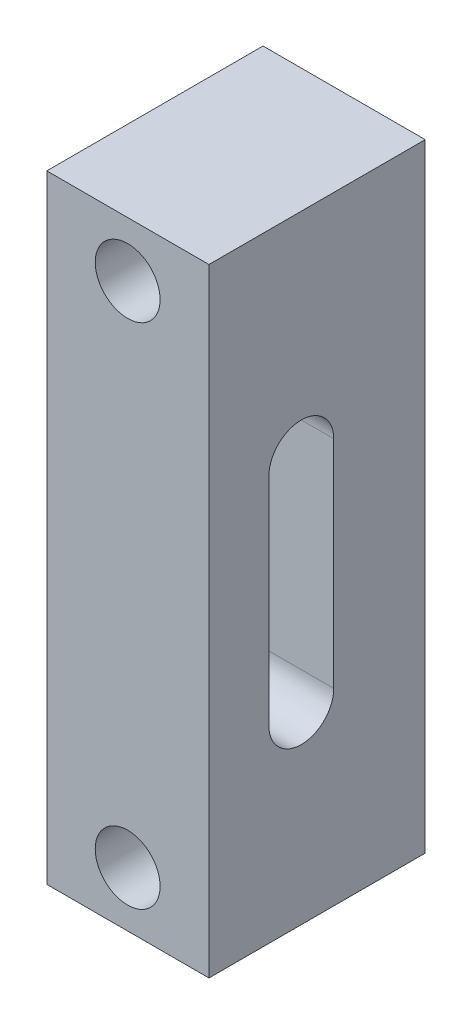
ISO-10303-21;
HEADER;
FILE_DESCRIPTION(('STEP AP214'),'2;1');
FILE_NAME('part.step','',(''),(''),'','','');
FILE_SCHEMA(('AUTOMOTIVE_DESIGN { 1 0 10303 214 1 1 1 1 }'));
ENDSEC;
DATA;
#1=APPLICATION_CONTEXT('core data for automotive mechanical design processes');
#2=APPLICATION_PROTOCOL_DEFINITION('international standard','automotive_design',2000,#1);
#3=PRODUCT_CONTEXT('',#1,'mechanical');
#4=PRODUCT('Part','Part','',(#3));
#5=PRODUCT_RELATED_PRODUCT_CATEGORY('part','',(#4));
#6=PRODUCT_DEFINITION_FORMATION('','',#4);
#7=PRODUCT_DEFINITION_CONTEXT('part definition',#1,'design');
#8=PRODUCT_DEFINITION('design','',#6,#7);
#9=PRODUCT_DEFINITION_SHAPE('','',#8);
#10=(LENGTH_UNIT() NAMED_UNIT(*) SI_UNIT(.MILLI.,.METRE.));
#11=(NAMED_UNIT(*) PLANE_ANGLE_UNIT() SI_UNIT($,.RADIAN.));
#12=(NAMED_UNIT(*) SI_UNIT($,.STERADIAN.) SOLID_ANGLE_UNIT());
#13=UNCERTAINTY_MEASURE_WITH_UNIT(LENGTH_MEASURE(1.E-05),#10,'distance_accuracy_value','');
#14=(GEOMETRIC_REPRESENTATION_CONTEXT(3) GLOBAL_UNCERTAINTY_ASSIGNED_CONTEXT((#13)) GLOBAL_UNIT_ASSIGNED_CONTEXT((#10,
#11,#12)) REPRESENTATION_CONTEXT('',''));
#15=CARTESIAN_POINT('',(0.,0.,0.));
#16=DIRECTION('',(0.,0.,1.));
#17=DIRECTION('',(1.,0.,0.));
#18=AXIS2_PLACEMENT_3D('',#15,#16,#17);
#19=CARTESIAN_POINT('',(27.4661419757527,-151.906947320831,20.));
#20=DIRECTION('',(1.,0.,0.));
#21=DIRECTION('',(0.,0.,-1.));
#22=AXIS2_PLACEMENT_3D('',#19,#20,#21);
#23=PLANE('',#22);
#24=DIRECTION('',(0.,1.,0.));
#25=VECTOR('',#24,1.);
#26=CARTESIAN_POINT('',(27.4661419757527,-191.629796135984,8.45999999999991));
#27=LINE('',#26,#25);
#28=CARTESIAN_POINT('',(27.4661419757527,-191.629796135984,8.4599999999999));
#29=VERTEX_POINT('',#28);
#30=CARTESIAN_POINT('',(27.4661419757527,-171.629796135984,8.45999999999991));
#31=VERTEX_POINT('',#30);
#32=EDGE_CURVE('E105',#29,#31,#27,.T.);
#33=ORIENTED_EDGE('',*,*,#32,.T.);
#34=CARTESIAN_POINT('',(27.4661419757527,-171.629796135984,11.4599999999999));
#35=DIRECTION('',(1.,0.,0.));
#36=DIRECTION('',(0.,1.,0.));
#37=AXIS2_PLACEMENT_3D('',#34,#35,#36);
#38=CIRCLE('',#37,3.);
#39=CARTESIAN_POINT('',(27.4661419757527,-171.629796135984,14.4599999999999));
#40=VERTEX_POINT('',#39);
#41=EDGE_CURVE('E99',#31,#40,#38,.T.);
#42=ORIENTED_EDGE('',*,*,#41,.T.);
#43=DIRECTION('',(0.,-1.,0.));
#44=VECTOR('',#43,1.);
#45=CARTESIAN_POINT('',(27.4661419757527,-171.629796135984,14.4599999999999));
#46=LINE('',#45,#44);
#47=CARTESIAN_POINT('',(27.4661419757527,-191.629796135984,14.4599999999999));
#48=VERTEX_POINT('',#47);
#49=EDGE_CURVE('E108',#40,#48,#46,.T.);
#50=ORIENTED_EDGE('',*,*,#49,.T.);
#51=CARTESIAN_POINT('',(27.4661419757527,-191.629796135984,11.4599999999999));
#52=DIRECTION('',(1.,0.,0.));
#53=DIRECTION('',(0.,1.,0.));
#54=AXIS2_PLACEMENT_3D('',#51,#52,#53);
#55=CIRCLE('',#54,3.);
#56=EDGE_CURVE('E47',#48,#29,#55,.T.);
#57=ORIENTED_EDGE('',*,*,#56,.T.);
#58=EDGE_LOOP('',(#33,#42,#50,#57));
#59=FACE_BOUND('',#58,.T.);
#60=DIRECTION('',(0.,-1.,0.));
#61=VECTOR('',#60,1.);
#62=CARTESIAN_POINT('',(27.4661419757527,-151.906947320831,0.));
#63=LINE('',#62,#61);
#64=CARTESIAN_POINT('',(27.4661419757527,-151.906947320831,0.));
#65=VERTEX_POINT('',#64);
#66=CARTESIAN_POINT('',(27.4661419757527,-209.056947320831,0.));
#67=VERTEX_POINT('',#66);
#68=EDGE_CURVE('E144',#65,#67,#63,.T.);
#69=ORIENTED_EDGE('',*,*,#68,.T.);
#70=DIRECTION('',(0.,0.,-1.));
#71=VECTOR('',#70,1.);
#72=CARTESIAN_POINT('',(27.4661419757527,-209.056947320831,20.));
#73=LINE('',#72,#71);
#74=CARTESIAN_POINT('',(27.4661419757527,-209.056947320831,20.));
#75=VERTEX_POINT('',#74);
#76=EDGE_CURVE('E11',#75,#67,#73,.T.);
#77=ORIENTED_EDGE('',*,*,#76,.F.);
#78=DIRECTION('',(0.,-1.,0.));
#79=VECTOR('',#78,1.);
#80=CARTESIAN_POINT('',(27.4661419757527,-151.906947320831,20.));
#81=LINE('',#80,#79);
#82=CARTESIAN_POINT('',(27.4661419757527,-151.906947320831,20.));
#83=VERTEX_POINT('',#82);
#84=EDGE_CURVE('E145',#83,#75,#81,.T.);
#85=ORIENTED_EDGE('',*,*,#84,.F.);
#86=DIRECTION('',(0.,0.,-1.));
#87=VECTOR('',#86,1.);
#88=CARTESIAN_POINT('',(27.4661419757527,-151.906947320831,20.));
#89=LINE('',#88,#87);
#90=EDGE_CURVE('E155',#83,#65,#89,.T.);
#91=ORIENTED_EDGE('',*,*,#90,.T.);
#92=EDGE_LOOP('',(#69,#77,#85,#91));
#93=FACE_BOUND('',#92,.T.);
#94=ADVANCED_FACE('F33',(#59,#93),#23,.F.);
#95=CARTESIAN_POINT('',(27.4661419757527,-209.056947320831,20.));
#96=DIRECTION('',(0.,1.,0.));
#97=DIRECTION('',(0.,0.,1.));
#98=AXIS2_PLACEMENT_3D('',#95,#96,#97);
#99=PLANE('',#98);
#100=DIRECTION('',(1.,0.,0.));
#101=VECTOR('',#100,1.);
#102=CARTESIAN_POINT('',(27.4661419757527,-209.056947320831,0.));
#103=LINE('',#102,#101);
#104=CARTESIAN_POINT('',(42.4661419757527,-209.056947320831,0.));
#105=VERTEX_POINT('',#104);
#106=EDGE_CURVE('E158',#67,#105,#103,.T.);
#107=ORIENTED_EDGE('',*,*,#106,.T.);
#108=DIRECTION('',(0.,0.,-1.));
#109=VECTOR('',#108,1.);
#110=CARTESIAN_POINT('',(42.4661419757527,-209.056947320831,20.));
#111=LINE('',#110,#109);
#112=CARTESIAN_POINT('',(42.4661419757527,-209.056947320831,20.));
#113=VERTEX_POINT('',#112);
#114=EDGE_CURVE('E40',#113,#105,#111,.T.);
#115=ORIENTED_EDGE('',*,*,#114,.F.);
#116=DIRECTION('',(1.,0.,0.));
#117=VECTOR('',#116,1.);
#118=CARTESIAN_POINT('',(27.4661419757527,-209.056947320831,20.));
#119=LINE('',#118,#117);
#120=EDGE_CURVE('E148',#75,#113,#119,.T.);
#121=ORIENTED_EDGE('',*,*,#120,.F.);
#122=ORIENTED_EDGE('',*,*,#76,.T.);
#123=EDGE_LOOP('',(#107,#115,#121,#122));
#124=FACE_BOUND('',#123,.T.);
#125=ADVANCED_FACE('F187',(#124),#99,.F.);
#126=CARTESIAN_POINT('',(42.4661419757527,-151.906947320831,20.));
#127=DIRECTION('',(-1.,0.,0.));
#128=DIRECTION('',(0.,-1.,0.));
#129=AXIS2_PLACEMENT_3D('',#126,#127,#128);
#130=PLANE('',#129);
#131=DIRECTION('',(0.,-1.,0.));
#132=VECTOR('',#131,1.);
#133=CARTESIAN_POINT('',(42.4661419757528,-171.629796135984,14.4599999999999));
#134=LINE('',#133,#132);
#135=CARTESIAN_POINT('',(42.4661419757527,-171.629796135984,14.4599999999999));
#136=VERTEX_POINT('',#135);
#137=CARTESIAN_POINT('',(42.4661419757528,-191.629796135984,14.4599999999999));
#138=VERTEX_POINT('',#137);
#139=EDGE_CURVE('E123',#136,#138,#134,.T.);
#140=ORIENTED_EDGE('',*,*,#139,.F.);
#141=CARTESIAN_POINT('',(42.4661419757528,-171.629796135984,11.4599999999999));
#142=DIRECTION('',(1.,0.,0.));
#143=DIRECTION('',(0.,1.,0.));
#144=AXIS2_PLACEMENT_3D('',#141,#142,#143);
#145=CIRCLE('',#144,3.);
#146=CARTESIAN_POINT('',(42.4661419757528,-171.629796135984,8.45999999999991));
#147=VERTEX_POINT('',#146);
#148=EDGE_CURVE('E55',#147,#136,#145,.T.);
#149=ORIENTED_EDGE('',*,*,#148,.F.);
#150=DIRECTION('',(0.,1.,0.));
#151=VECTOR('',#150,1.);
#152=CARTESIAN_POINT('',(42.4661419757528,-191.629796135984,8.45999999999991));
#153=LINE('',#152,#151);
#154=CARTESIAN_POINT('',(42.4661419757528,-191.629796135984,8.4599999999999));
#155=VERTEX_POINT('',#154);
#156=EDGE_CURVE('E114',#155,#147,#153,.T.);
#157=ORIENTED_EDGE('',*,*,#156,.F.);
#158=CARTESIAN_POINT('',(42.4661419757528,-191.629796135984,11.4599999999999));
#159=DIRECTION('',(1.,0.,0.));
#160=DIRECTION('',(0.,1.,0.));
#161=AXIS2_PLACEMENT_3D('',#158,#159,#160);
#162=CIRCLE('',#161,3.);
#163=EDGE_CURVE('E117',#138,#155,#162,.T.);
#164=ORIENTED_EDGE('',*,*,#163,.F.);
#165=EDGE_LOOP('',(#140,#149,#157,#164));
#166=FACE_BOUND('',#165,.T.);
#167=DIRECTION('',(0.,1.,0.));
#168=VECTOR('',#167,1.);
#169=CARTESIAN_POINT('',(42.4661419757527,-151.906947320831,0.));
#170=LINE('',#169,#168);
#171=CARTESIAN_POINT('',(42.4661419757527,-151.906947320831,0.));
#172=VERTEX_POINT('',#171);
#173=EDGE_CURVE('E160',#105,#172,#170,.T.);
#174=ORIENTED_EDGE('',*,*,#173,.T.);
#175=DIRECTION('',(0.,0.,-1.));
#176=VECTOR('',#175,1.);
#177=CARTESIAN_POINT('',(42.4661419757527,-151.906947320831,20.));
#178=LINE('',#177,#176);
#179=CARTESIAN_POINT('',(42.4661419757527,-151.906947320831,20.));
#180=VERTEX_POINT('',#179);
#181=EDGE_CURVE('E165',#180,#172,#178,.T.);
#182=ORIENTED_EDGE('',*,*,#181,.F.);
#183=DIRECTION('',(0.,1.,0.));
#184=VECTOR('',#183,1.);
#185=CARTESIAN_POINT('',(42.4661419757527,-151.906947320831,20.));
#186=LINE('',#185,#184);
#187=EDGE_CURVE('E151',#113,#180,#186,.T.);
#188=ORIENTED_EDGE('',*,*,#187,.F.);
#189=ORIENTED_EDGE('',*,*,#114,.T.);
#190=EDGE_LOOP('',(#174,#182,#188,#189));
#191=FACE_BOUND('',#190,.T.);
#192=ADVANCED_FACE('F172',(#166,#191),#130,.F.);
#193=CARTESIAN_POINT('',(27.4661419757527,-151.906947320831,20.));
#194=DIRECTION('',(0.,-1.,0.));
#195=DIRECTION('',(0.,0.,-1.));
#196=AXIS2_PLACEMENT_3D('',#193,#194,#195);
#197=PLANE('',#196);
#198=DIRECTION('',(-1.,0.,0.));
#199=VECTOR('',#198,1.);
#200=CARTESIAN_POINT('',(27.4661419757527,-151.906947320831,0.));
#201=LINE('',#200,#199);
#202=EDGE_CURVE('E149',#172,#65,#201,.T.);
#203=ORIENTED_EDGE('',*,*,#202,.T.);
#204=ORIENTED_EDGE('',*,*,#90,.F.);
#205=DIRECTION('',(-1.,0.,0.));
#206=VECTOR('',#205,1.);
#207=CARTESIAN_POINT('',(27.4661419757527,-151.906947320831,20.));
#208=LINE('',#207,#206);
#209=EDGE_CURVE('E153',#180,#83,#208,.T.);
#210=ORIENTED_EDGE('',*,*,#209,.F.);
#211=ORIENTED_EDGE('',*,*,#181,.T.);
#212=EDGE_LOOP('',(#203,#204,#210,#211));
#213=FACE_BOUND('',#212,.T.);
#214=ADVANCED_FACE('F181',(#213),#197,.F.);
#215=CARTESIAN_POINT('',(0.,0.,20.));
#216=DIRECTION('',(0.,0.,1.));
#217=DIRECTION('',(1.,0.,0.));
#218=AXIS2_PLACEMENT_3D('',#215,#216,#217);
#219=PLANE('',#218);
#220=CARTESIAN_POINT('',(34.9461419757537,-156.986877707206,20.));
#221=DIRECTION('',(0.,0.,1.));
#222=DIRECTION('',(1.,0.,0.));
#223=AXIS2_PLACEMENT_3D('',#220,#221,#222);
#224=CIRCLE('',#223,2.99999999999999);
#225=CARTESIAN_POINT('',(37.9461419757536,-156.986877707206,20.));
#226=VERTEX_POINT('',#225);
#227=EDGE_CURVE('E135',#226,#226,#224,.T.);
#228=ORIENTED_EDGE('',*,*,#227,.F.);
#229=EDGE_LOOP('',(#228));
#230=FACE_BOUND('',#229,.T.);
#231=CARTESIAN_POINT('',(34.9461419757537,-203.976877702794,20.));
#232=DIRECTION('',(0.,0.,1.));
#233=DIRECTION('',(1.,0.,0.));
#234=AXIS2_PLACEMENT_3D('',#231,#232,#233);
#235=CIRCLE('',#234,2.99999999999999);
#236=CARTESIAN_POINT('',(37.9461419757536,-203.976877702794,20.));
#237=VERTEX_POINT('',#236);
#238=EDGE_CURVE('E141',#237,#237,#235,.T.);
#239=ORIENTED_EDGE('',*,*,#238,.F.);
#240=EDGE_LOOP('',(#239));
#241=FACE_BOUND('',#240,.T.);
#242=ORIENTED_EDGE('',*,*,#84,.T.);
#243=ORIENTED_EDGE('',*,*,#120,.T.);
#244=ORIENTED_EDGE('',*,*,#187,.T.);
#245=ORIENTED_EDGE('',*,*,#209,.T.);
#246=EDGE_LOOP('',(#242,#243,#244,#245));
#247=FACE_BOUND('',#246,.T.);
#248=ADVANCED_FACE('F186',(#230,#241,#247),#219,.T.);
#249=CARTESIAN_POINT('',(0.,0.,0.));
#250=DIRECTION('',(0.,0.,1.));
#251=DIRECTION('',(1.,0.,0.));
#252=AXIS2_PLACEMENT_3D('',#249,#250,#251);
#253=PLANE('',#252);
#254=CARTESIAN_POINT('',(34.9461419757537,-156.986877707206,0.));
#255=DIRECTION('',(0.,0.,-1.));
#256=DIRECTION('',(-1.,0.,0.));
#257=AXIS2_PLACEMENT_3D('',#254,#255,#256);
#258=CIRCLE('',#257,2.99999999999999);
#259=CARTESIAN_POINT('',(31.9461419757537,-156.986877707206,0.));
#260=VERTEX_POINT('',#259);
#261=EDGE_CURVE('E129',#260,#260,#258,.T.);
#262=ORIENTED_EDGE('',*,*,#261,.F.);
#263=EDGE_LOOP('',(#262));
#264=FACE_BOUND('',#263,.T.);
#265=CARTESIAN_POINT('',(34.9461419757537,-203.976877702794,0.));
#266=DIRECTION('',(0.,0.,-1.));
#267=DIRECTION('',(-1.,0.,0.));
#268=AXIS2_PLACEMENT_3D('',#265,#266,#267);
#269=CIRCLE('',#268,2.99999999999999);
#270=CARTESIAN_POINT('',(31.9461419757537,-203.976877702794,0.));
#271=VERTEX_POINT('',#270);
#272=EDGE_CURVE('E138',#271,#271,#269,.T.);
#273=ORIENTED_EDGE('',*,*,#272,.F.);
#274=EDGE_LOOP('',(#273));
#275=FACE_BOUND('',#274,.T.);
#276=ORIENTED_EDGE('',*,*,#68,.F.);
#277=ORIENTED_EDGE('',*,*,#202,.F.);
#278=ORIENTED_EDGE('',*,*,#173,.F.);
#279=ORIENTED_EDGE('',*,*,#106,.F.);
#280=EDGE_LOOP('',(#276,#277,#278,#279));
#281=FACE_BOUND('',#280,.T.);
#282=ADVANCED_FACE('F178',(#264,#275,#281),#253,.F.);
#283=CARTESIAN_POINT('',(34.9461419757537,-203.976877702794,0.));
#284=DIRECTION('',(0.,0.,-1.));
#285=DIRECTION('',(-1.,0.,0.));
#286=AXIS2_PLACEMENT_3D('',#283,#284,#285);
#287=CYLINDRICAL_SURFACE('',#286,2.99999999999999);
#288=ORIENTED_EDGE('',*,*,#238,.T.);
#289=EDGE_LOOP('',(#288));
#290=FACE_BOUND('',#289,.T.);
#291=ORIENTED_EDGE('',*,*,#272,.T.);
#292=EDGE_LOOP('',(#291));
#293=FACE_BOUND('',#292,.T.);
#294=ADVANCED_FACE('F200',(#290,#293),#287,.F.);
#295=CARTESIAN_POINT('',(34.9461419757537,-156.986877707206,0.));
#296=DIRECTION('',(0.,0.,-1.));
#297=DIRECTION('',(-1.,0.,0.));
#298=AXIS2_PLACEMENT_3D('',#295,#296,#297);
#299=CYLINDRICAL_SURFACE('',#298,2.99999999999999);
#300=ORIENTED_EDGE('',*,*,#227,.T.);
#301=EDGE_LOOP('',(#300));
#302=FACE_BOUND('',#301,.T.);
#303=ORIENTED_EDGE('',*,*,#261,.T.);
#304=EDGE_LOOP('',(#303));
#305=FACE_BOUND('',#304,.T.);
#306=ADVANCED_FACE('F207',(#302,#305),#299,.F.);
#307=CARTESIAN_POINT('',(27.4661419757527,-171.629796135984,11.4599999999999));
#308=DIRECTION('',(1.,0.,0.));
#309=DIRECTION('',(0.,1.,0.));
#310=AXIS2_PLACEMENT_3D('',#307,#308,#309);
#311=CYLINDRICAL_SURFACE('',#310,3.);
#312=ORIENTED_EDGE('',*,*,#148,.T.);
#313=DIRECTION('',(1.,0.,0.));
#314=VECTOR('',#313,1.);
#315=CARTESIAN_POINT('',(27.4661419757527,-171.629796135984,14.4599999999999));
#316=LINE('',#315,#314);
#317=EDGE_CURVE('E95',#40,#136,#316,.T.);
#318=ORIENTED_EDGE('',*,*,#317,.F.);
#319=ORIENTED_EDGE('',*,*,#41,.F.);
#320=DIRECTION('',(1.,0.,0.));
#321=VECTOR('',#320,1.);
#322=CARTESIAN_POINT('',(27.4661419757527,-171.629796135984,8.45999999999991));
#323=LINE('',#322,#321);
#324=EDGE_CURVE('E127',#31,#147,#323,.T.);
#325=ORIENTED_EDGE('',*,*,#324,.T.);
#326=EDGE_LOOP('',(#312,#318,#319,#325));
#327=FACE_BOUND('',#326,.T.);
#328=ADVANCED_FACE('F97',(#327),#311,.F.);
#329=CARTESIAN_POINT('',(27.4661419757527,-191.629796135984,8.45999999999991));
#330=DIRECTION('',(0.,0.,-1.));
#331=DIRECTION('',(0.,1.,0.));
#332=AXIS2_PLACEMENT_3D('',#329,#330,#331);
#333=PLANE('',#332);
#334=ORIENTED_EDGE('',*,*,#156,.T.);
#335=ORIENTED_EDGE('',*,*,#324,.F.);
#336=ORIENTED_EDGE('',*,*,#32,.F.);
#337=DIRECTION('',(1.,0.,0.));
#338=VECTOR('',#337,1.);
#339=CARTESIAN_POINT('',(27.4661419757527,-191.629796135984,8.4599999999999));
#340=LINE('',#339,#338);
#341=EDGE_CURVE('E130',#29,#155,#340,.T.);
#342=ORIENTED_EDGE('',*,*,#341,.T.);
#343=EDGE_LOOP('',(#334,#335,#336,#342));
#344=FACE_BOUND('',#343,.T.);
#345=ADVANCED_FACE('F214',(#344),#333,.F.);
#346=CARTESIAN_POINT('',(27.4661419757527,-191.629796135984,11.4599999999999));
#347=DIRECTION('',(1.,0.,0.));
#348=DIRECTION('',(0.,1.,0.));
#349=AXIS2_PLACEMENT_3D('',#346,#347,#348);
#350=CYLINDRICAL_SURFACE('',#349,3.);
#351=ORIENTED_EDGE('',*,*,#163,.T.);
#352=ORIENTED_EDGE('',*,*,#341,.F.);
#353=ORIENTED_EDGE('',*,*,#56,.F.);
#354=DIRECTION('',(1.,0.,0.));
#355=VECTOR('',#354,1.);
#356=CARTESIAN_POINT('',(27.4661419757527,-191.629796135984,14.4599999999999));
#357=LINE('',#356,#355);
#358=EDGE_CURVE('E104',#48,#138,#357,.T.);
#359=ORIENTED_EDGE('',*,*,#358,.T.);
#360=EDGE_LOOP('',(#351,#352,#353,#359));
#361=FACE_BOUND('',#360,.T.);
#362=ADVANCED_FACE('F217',(#361),#350,.F.);
#363=CARTESIAN_POINT('',(27.4661419757527,-171.629796135984,14.4599999999999));
#364=DIRECTION('',(0.,0.,1.));
#365=DIRECTION('',(0.,-1.,0.));
#366=AXIS2_PLACEMENT_3D('',#363,#364,#365);
#367=PLANE('',#366);
#368=ORIENTED_EDGE('',*,*,#139,.T.);
#369=ORIENTED_EDGE('',*,*,#358,.F.);
#370=ORIENTED_EDGE('',*,*,#49,.F.);
#371=ORIENTED_EDGE('',*,*,#317,.T.);
#372=EDGE_LOOP('',(#368,#369,#370,#371));
#373=FACE_BOUND('',#372,.T.);
#374=ADVANCED_FACE('F109',(#373),#367,.F.);
#375=CLOSED_SHELL('',(#94,#125,#192,#214,#248,#282,#294,#306,#328,#345,#362,#374));
#376=MANIFOLD_SOLID_BREP('B2',#375);
#377=ADVANCED_BREP_SHAPE_REPRESENTATION('',(#18,#376),#14);
#378=SHAPE_DEFINITION_REPRESENTATION(#9,#377);
ENDSEC;
END-ISO-10303-21;
